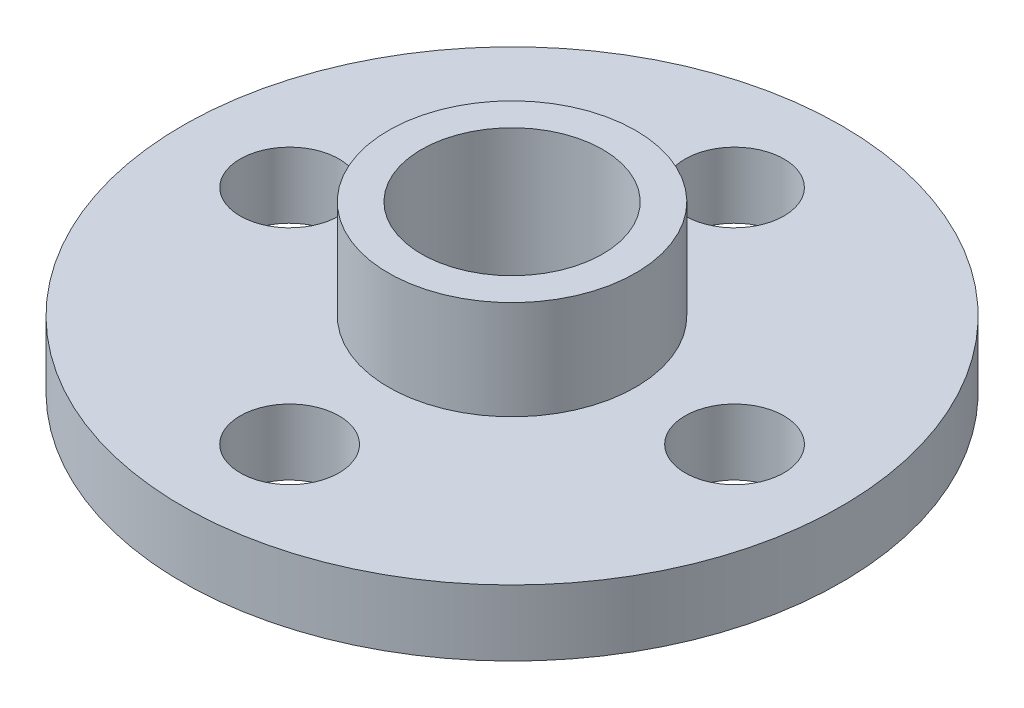
ISO-10303-21;
HEADER;
FILE_DESCRIPTION(('STEP AP214'),'2;1');
FILE_NAME('part.step','',(''),(''),'','','');
FILE_SCHEMA(('AUTOMOTIVE_DESIGN { 1 0 10303 214 1 1 1 1 }'));
ENDSEC;
DATA;
#1=APPLICATION_CONTEXT('core data for automotive mechanical design processes');
#2=APPLICATION_PROTOCOL_DEFINITION('international standard','automotive_design',2000,#1);
#3=PRODUCT_CONTEXT('',#1,'mechanical');
#4=PRODUCT('Part','Part','',(#3));
#5=PRODUCT_RELATED_PRODUCT_CATEGORY('part','',(#4));
#6=PRODUCT_DEFINITION_FORMATION('','',#4);
#7=PRODUCT_DEFINITION_CONTEXT('part definition',#1,'design');
#8=PRODUCT_DEFINITION('design','',#6,#7);
#9=PRODUCT_DEFINITION_SHAPE('','',#8);
#10=(LENGTH_UNIT() NAMED_UNIT(*) SI_UNIT(.MILLI.,.METRE.));
#11=(NAMED_UNIT(*) PLANE_ANGLE_UNIT() SI_UNIT($,.RADIAN.));
#12=(NAMED_UNIT(*) SI_UNIT($,.STERADIAN.) SOLID_ANGLE_UNIT());
#13=UNCERTAINTY_MEASURE_WITH_UNIT(LENGTH_MEASURE(1.E-05),#10,'distance_accuracy_value','');
#14=(GEOMETRIC_REPRESENTATION_CONTEXT(3) GLOBAL_UNCERTAINTY_ASSIGNED_CONTEXT((#13)) GLOBAL_UNIT_ASSIGNED_CONTEXT((#10,
#11,#12)) REPRESENTATION_CONTEXT('',''));
#15=CARTESIAN_POINT('',(0.,0.,0.));
#16=DIRECTION('',(0.,0.,1.));
#17=DIRECTION('',(1.,0.,0.));
#18=AXIS2_PLACEMENT_3D('',#15,#16,#17);
#19=CARTESIAN_POINT('',(0.,0.,0.));
#20=DIRECTION('',(0.,1.,0.));
#21=DIRECTION('',(0.,0.,-1.));
#22=AXIS2_PLACEMENT_3D('',#19,#20,#21);
#23=CYLINDRICAL_SURFACE('',#22,1.5);
#24=CARTESIAN_POINT('',(0.,0.,0.));
#25=DIRECTION('',(0.,-1.,0.));
#26=DIRECTION('',(0.,0.,-1.));
#27=AXIS2_PLACEMENT_3D('',#24,#25,#26);
#28=CIRCLE('',#27,1.5);
#29=CARTESIAN_POINT('',(0.,0.,-1.5));
#30=VERTEX_POINT('',#29);
#31=EDGE_CURVE('E83',#30,#30,#28,.T.);
#32=ORIENTED_EDGE('',*,*,#31,.T.);
#33=EDGE_LOOP('',(#32));
#34=FACE_BOUND('',#33,.T.);
#35=CARTESIAN_POINT('',(0.,0.5,0.));
#36=DIRECTION('',(0.,-1.,0.));
#37=DIRECTION('',(0.,0.,-1.));
#38=AXIS2_PLACEMENT_3D('',#35,#36,#37);
#39=CIRCLE('',#38,1.5);
#40=CARTESIAN_POINT('',(0.,0.5,-1.5));
#41=VERTEX_POINT('',#40);
#42=EDGE_CURVE('E45',#41,#41,#39,.F.);
#43=ORIENTED_EDGE('',*,*,#42,.T.);
#44=EDGE_LOOP('',(#43));
#45=FACE_BOUND('',#44,.T.);
#46=ADVANCED_FACE('F41',(#34,#45),#23,.F.);
#47=CARTESIAN_POINT('',(0.,2.,0.));
#48=DIRECTION('',(0.,-1.,0.));
#49=DIRECTION('',(0.,0.,1.));
#50=AXIS2_PLACEMENT_3D('',#47,#48,#49);
#51=CYLINDRICAL_SURFACE('',#50,10.);
#52=CARTESIAN_POINT('',(0.,2.,0.));
#53=DIRECTION('',(0.,-1.,0.));
#54=DIRECTION('',(0.,0.,-1.));
#55=AXIS2_PLACEMENT_3D('',#52,#53,#54);
#56=CIRCLE('',#55,10.);
#57=CARTESIAN_POINT('',(0.,2.,-10.));
#58=VERTEX_POINT('',#57);
#59=EDGE_CURVE('E10',#58,#58,#56,.T.);
#60=ORIENTED_EDGE('',*,*,#59,.T.);
#61=EDGE_LOOP('',(#60));
#62=FACE_BOUND('',#61,.T.);
#63=CARTESIAN_POINT('',(0.,0.,0.));
#64=DIRECTION('',(0.,-1.,0.));
#65=DIRECTION('',(0.,0.,-1.));
#66=AXIS2_PLACEMENT_3D('',#63,#64,#65);
#67=CIRCLE('',#66,10.);
#68=CARTESIAN_POINT('',(0.,0.,-10.));
#69=VERTEX_POINT('',#68);
#70=EDGE_CURVE('E49',#69,#69,#67,.T.);
#71=ORIENTED_EDGE('',*,*,#70,.F.);
#72=EDGE_LOOP('',(#71));
#73=FACE_BOUND('',#72,.T.);
#74=ADVANCED_FACE('F43',(#62,#73),#51,.T.);
#75=CARTESIAN_POINT('',(0.,2.,0.));
#76=DIRECTION('',(0.,1.,0.));
#77=DIRECTION('',(0.,0.,-1.));
#78=AXIS2_PLACEMENT_3D('',#75,#76,#77);
#79=PLANE('',#78);
#80=CARTESIAN_POINT('',(0.,2.,0.));
#81=DIRECTION('',(0.,-1.,0.));
#82=DIRECTION('',(0.,0.,-1.));
#83=AXIS2_PLACEMENT_3D('',#80,#81,#82);
#84=CIRCLE('',#83,3.75);
#85=CARTESIAN_POINT('',(0.,2.,-3.75));
#86=VERTEX_POINT('',#85);
#87=EDGE_CURVE('E80',#86,#86,#84,.T.);
#88=ORIENTED_EDGE('',*,*,#87,.T.);
#89=EDGE_LOOP('',(#88));
#90=FACE_BOUND('',#89,.T.);
#91=CARTESIAN_POINT('',(0.,2.,6.75));
#92=DIRECTION('',(0.,-1.,0.));
#93=DIRECTION('',(0.,0.,-1.));
#94=AXIS2_PLACEMENT_3D('',#91,#92,#93);
#95=CIRCLE('',#94,1.5);
#96=CARTESIAN_POINT('',(0.,2.,5.25));
#97=VERTEX_POINT('',#96);
#98=EDGE_CURVE('E75',#97,#97,#95,.T.);
#99=ORIENTED_EDGE('',*,*,#98,.T.);
#100=EDGE_LOOP('',(#99));
#101=FACE_BOUND('',#100,.T.);
#102=CARTESIAN_POINT('',(6.75,2.,0.));
#103=DIRECTION('',(0.,-1.,0.));
#104=DIRECTION('',(0.,0.,-1.));
#105=AXIS2_PLACEMENT_3D('',#102,#103,#104);
#106=CIRCLE('',#105,1.5);
#107=CARTESIAN_POINT('',(6.75,2.,-1.5));
#108=VERTEX_POINT('',#107);
#109=EDGE_CURVE('E69',#108,#108,#106,.T.);
#110=ORIENTED_EDGE('',*,*,#109,.T.);
#111=EDGE_LOOP('',(#110));
#112=FACE_BOUND('',#111,.T.);
#113=CARTESIAN_POINT('',(0.,2.,-6.75));
#114=DIRECTION('',(0.,-1.,0.));
#115=DIRECTION('',(0.,0.,1.));
#116=AXIS2_PLACEMENT_3D('',#113,#114,#115);
#117=CIRCLE('',#116,1.5);
#118=CARTESIAN_POINT('',(0.,2.,-5.25));
#119=VERTEX_POINT('',#118);
#120=EDGE_CURVE('E63',#119,#119,#117,.T.);
#121=ORIENTED_EDGE('',*,*,#120,.T.);
#122=EDGE_LOOP('',(#121));
#123=FACE_BOUND('',#122,.T.);
#124=CARTESIAN_POINT('',(-6.75,2.,0.));
#125=DIRECTION('',(0.,-1.,0.));
#126=DIRECTION('',(0.,0.,1.));
#127=AXIS2_PLACEMENT_3D('',#124,#125,#126);
#128=CIRCLE('',#127,1.5);
#129=CARTESIAN_POINT('',(-6.75,2.,1.5));
#130=VERTEX_POINT('',#129);
#131=EDGE_CURVE('E56',#130,#130,#128,.T.);
#132=ORIENTED_EDGE('',*,*,#131,.T.);
#133=EDGE_LOOP('',(#132));
#134=FACE_BOUND('',#133,.T.);
#135=ORIENTED_EDGE('',*,*,#59,.F.);
#136=EDGE_LOOP('',(#135));
#137=FACE_BOUND('',#136,.T.);
#138=ADVANCED_FACE('F119',(#90,#101,#112,#123,#134,#137),#79,.T.);
#139=CARTESIAN_POINT('',(0.,0.,0.));
#140=DIRECTION('',(0.,1.,0.));
#141=DIRECTION('',(0.,0.,-1.));
#142=AXIS2_PLACEMENT_3D('',#139,#140,#141);
#143=PLANE('',#142);
#144=ORIENTED_EDGE('',*,*,#31,.F.);
#145=EDGE_LOOP('',(#144));
#146=FACE_BOUND('',#145,.T.);
#147=CARTESIAN_POINT('',(0.,0.,6.75));
#148=DIRECTION('',(0.,-1.,0.));
#149=DIRECTION('',(0.,0.,-1.));
#150=AXIS2_PLACEMENT_3D('',#147,#148,#149);
#151=CIRCLE('',#150,1.5);
#152=CARTESIAN_POINT('',(0.,0.,5.25));
#153=VERTEX_POINT('',#152);
#154=EDGE_CURVE('E54',#153,#153,#151,.T.);
#155=ORIENTED_EDGE('',*,*,#154,.F.);
#156=EDGE_LOOP('',(#155));
#157=FACE_BOUND('',#156,.T.);
#158=CARTESIAN_POINT('',(6.75,0.,0.));
#159=DIRECTION('',(0.,-1.,0.));
#160=DIRECTION('',(0.,0.,-1.));
#161=AXIS2_PLACEMENT_3D('',#158,#159,#160);
#162=CIRCLE('',#161,1.5);
#163=CARTESIAN_POINT('',(6.75,0.,-1.5));
#164=VERTEX_POINT('',#163);
#165=EDGE_CURVE('E72',#164,#164,#162,.T.);
#166=ORIENTED_EDGE('',*,*,#165,.F.);
#167=EDGE_LOOP('',(#166));
#168=FACE_BOUND('',#167,.T.);
#169=CARTESIAN_POINT('',(0.,0.,-6.75));
#170=DIRECTION('',(0.,-1.,0.));
#171=DIRECTION('',(0.,0.,1.));
#172=AXIS2_PLACEMENT_3D('',#169,#170,#171);
#173=CIRCLE('',#172,1.5);
#174=CARTESIAN_POINT('',(0.,0.,-5.25));
#175=VERTEX_POINT('',#174);
#176=EDGE_CURVE('E66',#175,#175,#173,.T.);
#177=ORIENTED_EDGE('',*,*,#176,.F.);
#178=EDGE_LOOP('',(#177));
#179=FACE_BOUND('',#178,.T.);
#180=CARTESIAN_POINT('',(-6.75,0.,0.));
#181=DIRECTION('',(0.,-1.,0.));
#182=DIRECTION('',(0.,0.,1.));
#183=AXIS2_PLACEMENT_3D('',#180,#181,#182);
#184=CIRCLE('',#183,1.5);
#185=CARTESIAN_POINT('',(-6.75,0.,1.5));
#186=VERTEX_POINT('',#185);
#187=EDGE_CURVE('E59',#186,#186,#184,.T.);
#188=ORIENTED_EDGE('',*,*,#187,.F.);
#189=EDGE_LOOP('',(#188));
#190=FACE_BOUND('',#189,.T.);
#191=ORIENTED_EDGE('',*,*,#70,.T.);
#192=EDGE_LOOP('',(#191));
#193=FACE_BOUND('',#192,.T.);
#194=ADVANCED_FACE('F139',(#146,#157,#168,#179,#190,#193),#143,.F.);
#195=CARTESIAN_POINT('',(-6.75,0.,0.));
#196=DIRECTION('',(0.,1.,0.));
#197=DIRECTION('',(0.,0.,-1.));
#198=AXIS2_PLACEMENT_3D('',#195,#196,#197);
#199=CYLINDRICAL_SURFACE('',#198,1.5);
#200=ORIENTED_EDGE('',*,*,#187,.T.);
#201=EDGE_LOOP('',(#200));
#202=FACE_BOUND('',#201,.T.);
#203=ORIENTED_EDGE('',*,*,#131,.F.);
#204=EDGE_LOOP('',(#203));
#205=FACE_BOUND('',#204,.T.);
#206=ADVANCED_FACE('F135',(#202,#205),#199,.F.);
#207=CARTESIAN_POINT('',(0.,0.,-6.75));
#208=DIRECTION('',(0.,1.,0.));
#209=DIRECTION('',(0.,0.,-1.));
#210=AXIS2_PLACEMENT_3D('',#207,#208,#209);
#211=CYLINDRICAL_SURFACE('',#210,1.5);
#212=ORIENTED_EDGE('',*,*,#176,.T.);
#213=EDGE_LOOP('',(#212));
#214=FACE_BOUND('',#213,.T.);
#215=ORIENTED_EDGE('',*,*,#120,.F.);
#216=EDGE_LOOP('',(#215));
#217=FACE_BOUND('',#216,.T.);
#218=ADVANCED_FACE('F131',(#214,#217),#211,.F.);
#219=CARTESIAN_POINT('',(6.75,0.,0.));
#220=DIRECTION('',(0.,1.,0.));
#221=DIRECTION('',(0.,0.,-1.));
#222=AXIS2_PLACEMENT_3D('',#219,#220,#221);
#223=CYLINDRICAL_SURFACE('',#222,1.5);
#224=ORIENTED_EDGE('',*,*,#165,.T.);
#225=EDGE_LOOP('',(#224));
#226=FACE_BOUND('',#225,.T.);
#227=ORIENTED_EDGE('',*,*,#109,.F.);
#228=EDGE_LOOP('',(#227));
#229=FACE_BOUND('',#228,.T.);
#230=ADVANCED_FACE('F127',(#226,#229),#223,.F.);
#231=CARTESIAN_POINT('',(0.,0.,6.75));
#232=DIRECTION('',(0.,1.,0.));
#233=DIRECTION('',(0.,0.,-1.));
#234=AXIS2_PLACEMENT_3D('',#231,#232,#233);
#235=CYLINDRICAL_SURFACE('',#234,1.5);
#236=ORIENTED_EDGE('',*,*,#154,.T.);
#237=EDGE_LOOP('',(#236));
#238=FACE_BOUND('',#237,.T.);
#239=ORIENTED_EDGE('',*,*,#98,.F.);
#240=EDGE_LOOP('',(#239));
#241=FACE_BOUND('',#240,.T.);
#242=ADVANCED_FACE('F123',(#238,#241),#235,.F.);
#243=CARTESIAN_POINT('',(0.,5.,0.));
#244=DIRECTION('',(0.,-1.,0.));
#245=DIRECTION('',(0.,0.,1.));
#246=AXIS2_PLACEMENT_3D('',#243,#244,#245);
#247=CYLINDRICAL_SURFACE('',#246,3.75);
#248=CARTESIAN_POINT('',(0.,5.,0.));
#249=DIRECTION('',(0.,-1.,0.));
#250=DIRECTION('',(0.,0.,-1.));
#251=AXIS2_PLACEMENT_3D('',#248,#249,#250);
#252=CIRCLE('',#251,3.75);
#253=CARTESIAN_POINT('',(0.,5.,-3.75));
#254=VERTEX_POINT('',#253);
#255=EDGE_CURVE('E60',#254,#254,#252,.T.);
#256=ORIENTED_EDGE('',*,*,#255,.T.);
#257=EDGE_LOOP('',(#256));
#258=FACE_BOUND('',#257,.T.);
#259=ORIENTED_EDGE('',*,*,#87,.F.);
#260=EDGE_LOOP('',(#259));
#261=FACE_BOUND('',#260,.T.);
#262=ADVANCED_FACE('F110',(#258,#261),#247,.T.);
#263=CARTESIAN_POINT('',(0.,5.,0.));
#264=DIRECTION('',(0.,1.,0.));
#265=DIRECTION('',(0.,0.,-1.));
#266=AXIS2_PLACEMENT_3D('',#263,#264,#265);
#267=PLANE('',#266);
#268=CARTESIAN_POINT('',(0.,5.,0.));
#269=DIRECTION('',(0.,-1.,0.));
#270=DIRECTION('',(0.,0.,-1.));
#271=AXIS2_PLACEMENT_3D('',#268,#269,#270);
#272=CIRCLE('',#271,2.75);
#273=CARTESIAN_POINT('',(0.,5.,-2.75));
#274=VERTEX_POINT('',#273);
#275=EDGE_CURVE('E88',#274,#274,#272,.T.);
#276=ORIENTED_EDGE('',*,*,#275,.T.);
#277=EDGE_LOOP('',(#276));
#278=FACE_BOUND('',#277,.T.);
#279=ORIENTED_EDGE('',*,*,#255,.F.);
#280=EDGE_LOOP('',(#279));
#281=FACE_BOUND('',#280,.T.);
#282=ADVANCED_FACE('F102',(#278,#281),#267,.T.);
#283=CARTESIAN_POINT('',(0.,0.5,0.));
#284=DIRECTION('',(0.,1.,0.));
#285=DIRECTION('',(0.,0.,-1.));
#286=AXIS2_PLACEMENT_3D('',#283,#284,#285);
#287=PLANE('',#286);
#288=CARTESIAN_POINT('',(0.,0.5,0.));
#289=DIRECTION('',(0.,-1.,0.));
#290=DIRECTION('',(0.,0.,-1.));
#291=AXIS2_PLACEMENT_3D('',#288,#289,#290);
#292=CIRCLE('',#291,2.75);
#293=CARTESIAN_POINT('',(0.,0.5,-2.75));
#294=VERTEX_POINT('',#293);
#295=EDGE_CURVE('E91',#294,#294,#292,.T.);
#296=ORIENTED_EDGE('',*,*,#295,.F.);
#297=EDGE_LOOP('',(#296));
#298=FACE_BOUND('',#297,.T.);
#299=ORIENTED_EDGE('',*,*,#42,.F.);
#300=EDGE_LOOP('',(#299));
#301=FACE_BOUND('',#300,.T.);
#302=ADVANCED_FACE('F99',(#298,#301),#287,.T.);
#303=CARTESIAN_POINT('',(0.,0.5,0.));
#304=DIRECTION('',(0.,1.,0.));
#305=DIRECTION('',(0.,0.,-1.));
#306=AXIS2_PLACEMENT_3D('',#303,#304,#305);
#307=CYLINDRICAL_SURFACE('',#306,2.75);
#308=ORIENTED_EDGE('',*,*,#295,.T.);
#309=EDGE_LOOP('',(#308));
#310=FACE_BOUND('',#309,.T.);
#311=ORIENTED_EDGE('',*,*,#275,.F.);
#312=EDGE_LOOP('',(#311));
#313=FACE_BOUND('',#312,.T.);
#314=ADVANCED_FACE('F101',(#310,#313),#307,.F.);
#315=CLOSED_SHELL('',(#46,#74,#138,#194,#206,#218,#230,#242,#262,#282,#302,#314));
#316=MANIFOLD_SOLID_BREP('B2',#315);
#317=ADVANCED_BREP_SHAPE_REPRESENTATION('',(#18,#316),#14);
#318=SHAPE_DEFINITION_REPRESENTATION(#9,#317);
ENDSEC;
END-ISO-10303-21;
